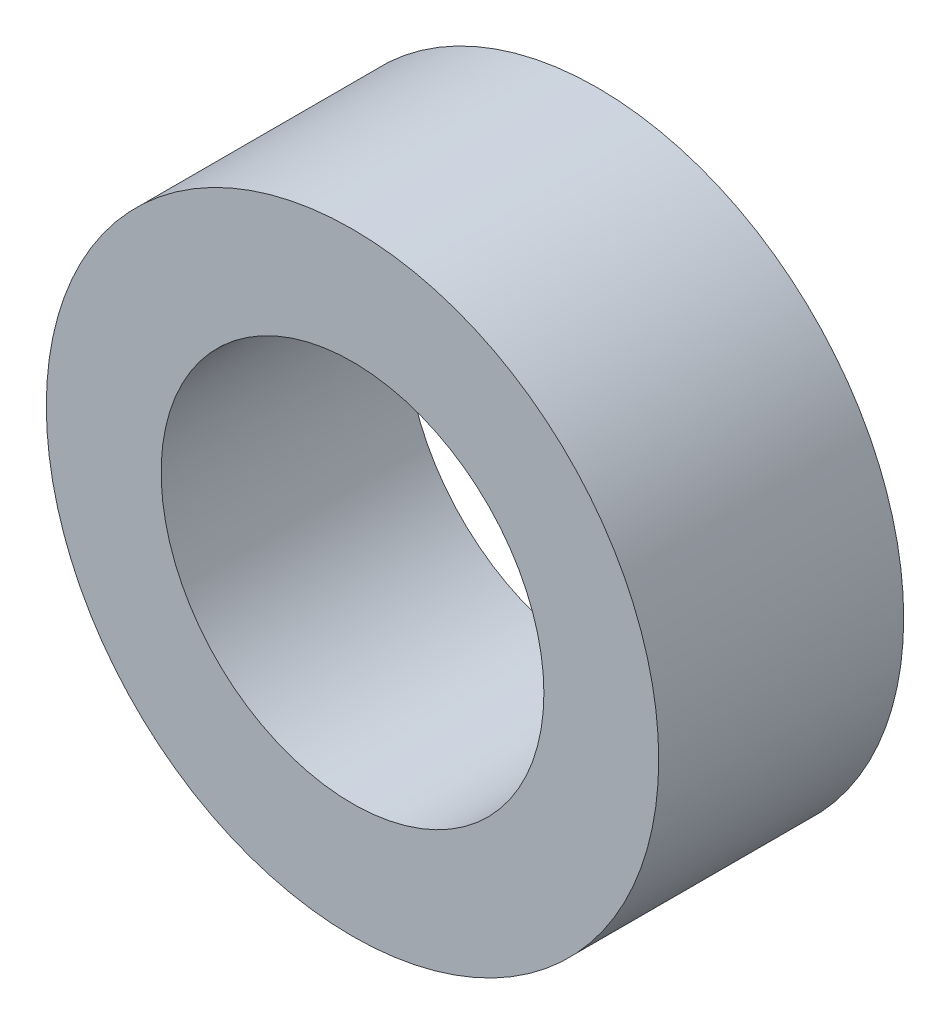
ISO-10303-21;
HEADER;
FILE_DESCRIPTION(('STEP AP214'),'2;1');
FILE_NAME('part.step','',(''),(''),'','','');
FILE_SCHEMA(('AUTOMOTIVE_DESIGN { 1 0 10303 214 1 1 1 1 }'));
ENDSEC;
DATA;
#1=APPLICATION_CONTEXT('core data for automotive mechanical design processes');
#2=APPLICATION_PROTOCOL_DEFINITION('international standard','automotive_design',2000,#1);
#3=PRODUCT_CONTEXT('',#1,'mechanical');
#4=PRODUCT('Part','Part','',(#3));
#5=PRODUCT_RELATED_PRODUCT_CATEGORY('part','',(#4));
#6=PRODUCT_DEFINITION_FORMATION('','',#4);
#7=PRODUCT_DEFINITION_CONTEXT('part definition',#1,'design');
#8=PRODUCT_DEFINITION('design','',#6,#7);
#9=PRODUCT_DEFINITION_SHAPE('','',#8);
#10=(LENGTH_UNIT() NAMED_UNIT(*) SI_UNIT(.MILLI.,.METRE.));
#11=(NAMED_UNIT(*) PLANE_ANGLE_UNIT() SI_UNIT($,.RADIAN.));
#12=(NAMED_UNIT(*) SI_UNIT($,.STERADIAN.) SOLID_ANGLE_UNIT());
#13=UNCERTAINTY_MEASURE_WITH_UNIT(LENGTH_MEASURE(1.E-05),#10,'distance_accuracy_value','');
#14=(GEOMETRIC_REPRESENTATION_CONTEXT(3) GLOBAL_UNCERTAINTY_ASSIGNED_CONTEXT((#13)) GLOBAL_UNIT_ASSIGNED_CONTEXT((#10,
#11,#12)) REPRESENTATION_CONTEXT('',''));
#15=CARTESIAN_POINT('',(0.,0.,0.));
#16=DIRECTION('',(0.,0.,1.));
#17=DIRECTION('',(1.,0.,0.));
#18=AXIS2_PLACEMENT_3D('',#15,#16,#17);
#19=CARTESIAN_POINT('',(0.,0.,3.2));
#20=DIRECTION('',(0.,0.,1.));
#21=DIRECTION('',(1.,0.,0.));
#22=AXIS2_PLACEMENT_3D('',#19,#20,#21);
#23=PLANE('',#22);
#24=CARTESIAN_POINT('',(0.,0.,3.2));
#25=DIRECTION('',(0.,0.,1.));
#26=DIRECTION('',(1.,0.,0.));
#27=AXIS2_PLACEMENT_3D('',#24,#25,#26);
#28=CIRCLE('',#27,4.);
#29=CARTESIAN_POINT('',(4.,0.,3.2));
#30=VERTEX_POINT('',#29);
#31=EDGE_CURVE('E10',#30,#30,#28,.T.);
#32=ORIENTED_EDGE('',*,*,#31,.T.);
#33=EDGE_LOOP('',(#32));
#34=FACE_BOUND('',#33,.T.);
#35=CARTESIAN_POINT('',(0.,0.,3.2));
#36=DIRECTION('',(0.,0.,1.));
#37=DIRECTION('',(1.,0.,0.));
#38=AXIS2_PLACEMENT_3D('',#35,#36,#37);
#39=CIRCLE('',#38,2.5);
#40=CARTESIAN_POINT('',(2.5,0.,3.2));
#41=VERTEX_POINT('',#40);
#42=EDGE_CURVE('E44',#41,#41,#39,.T.);
#43=ORIENTED_EDGE('',*,*,#42,.F.);
#44=EDGE_LOOP('',(#43));
#45=FACE_BOUND('',#44,.T.);
#46=ADVANCED_FACE('F33',(#34,#45),#23,.T.);
#47=CARTESIAN_POINT('',(0.,0.,0.));
#48=DIRECTION('',(0.,0.,1.));
#49=DIRECTION('',(1.,0.,0.));
#50=AXIS2_PLACEMENT_3D('',#47,#48,#49);
#51=PLANE('',#50);
#52=CARTESIAN_POINT('',(0.,0.,0.));
#53=DIRECTION('',(0.,0.,1.));
#54=DIRECTION('',(1.,0.,0.));
#55=AXIS2_PLACEMENT_3D('',#52,#53,#54);
#56=CIRCLE('',#55,4.);
#57=CARTESIAN_POINT('',(4.,0.,0.));
#58=VERTEX_POINT('',#57);
#59=EDGE_CURVE('E37',#58,#58,#56,.T.);
#60=ORIENTED_EDGE('',*,*,#59,.F.);
#61=EDGE_LOOP('',(#60));
#62=FACE_BOUND('',#61,.T.);
#63=CARTESIAN_POINT('',(0.,0.,0.));
#64=DIRECTION('',(0.,0.,1.));
#65=DIRECTION('',(1.,0.,0.));
#66=AXIS2_PLACEMENT_3D('',#63,#64,#65);
#67=CIRCLE('',#66,2.5);
#68=CARTESIAN_POINT('',(2.5,0.,0.));
#69=VERTEX_POINT('',#68);
#70=EDGE_CURVE('E46',#69,#69,#67,.T.);
#71=ORIENTED_EDGE('',*,*,#70,.T.);
#72=EDGE_LOOP('',(#71));
#73=FACE_BOUND('',#72,.T.);
#74=ADVANCED_FACE('F56',(#62,#73),#51,.F.);
#75=CARTESIAN_POINT('',(0.,0.,3.2));
#76=DIRECTION('',(0.,0.,-1.));
#77=DIRECTION('',(-1.,0.,0.));
#78=AXIS2_PLACEMENT_3D('',#75,#76,#77);
#79=CYLINDRICAL_SURFACE('',#78,4.);
#80=ORIENTED_EDGE('',*,*,#31,.F.);
#81=EDGE_LOOP('',(#80));
#82=FACE_BOUND('',#81,.T.);
#83=ORIENTED_EDGE('',*,*,#59,.T.);
#84=EDGE_LOOP('',(#83));
#85=FACE_BOUND('',#84,.T.);
#86=ADVANCED_FACE('F35',(#82,#85),#79,.T.);
#87=CARTESIAN_POINT('',(0.,0.,3.2));
#88=DIRECTION('',(0.,0.,-1.));
#89=DIRECTION('',(-1.,0.,0.));
#90=AXIS2_PLACEMENT_3D('',#87,#88,#89);
#91=CYLINDRICAL_SURFACE('',#90,2.5);
#92=ORIENTED_EDGE('',*,*,#42,.T.);
#93=EDGE_LOOP('',(#92));
#94=FACE_BOUND('',#93,.T.);
#95=ORIENTED_EDGE('',*,*,#70,.F.);
#96=EDGE_LOOP('',(#95));
#97=FACE_BOUND('',#96,.T.);
#98=ADVANCED_FACE('F52',(#94,#97),#91,.F.);
#99=CLOSED_SHELL('',(#46,#74,#86,#98));
#100=MANIFOLD_SOLID_BREP('B2',#99);
#101=ADVANCED_BREP_SHAPE_REPRESENTATION('',(#18,#100),#14);
#102=SHAPE_DEFINITION_REPRESENTATION(#9,#101);
ENDSEC;
END-ISO-10303-21;
